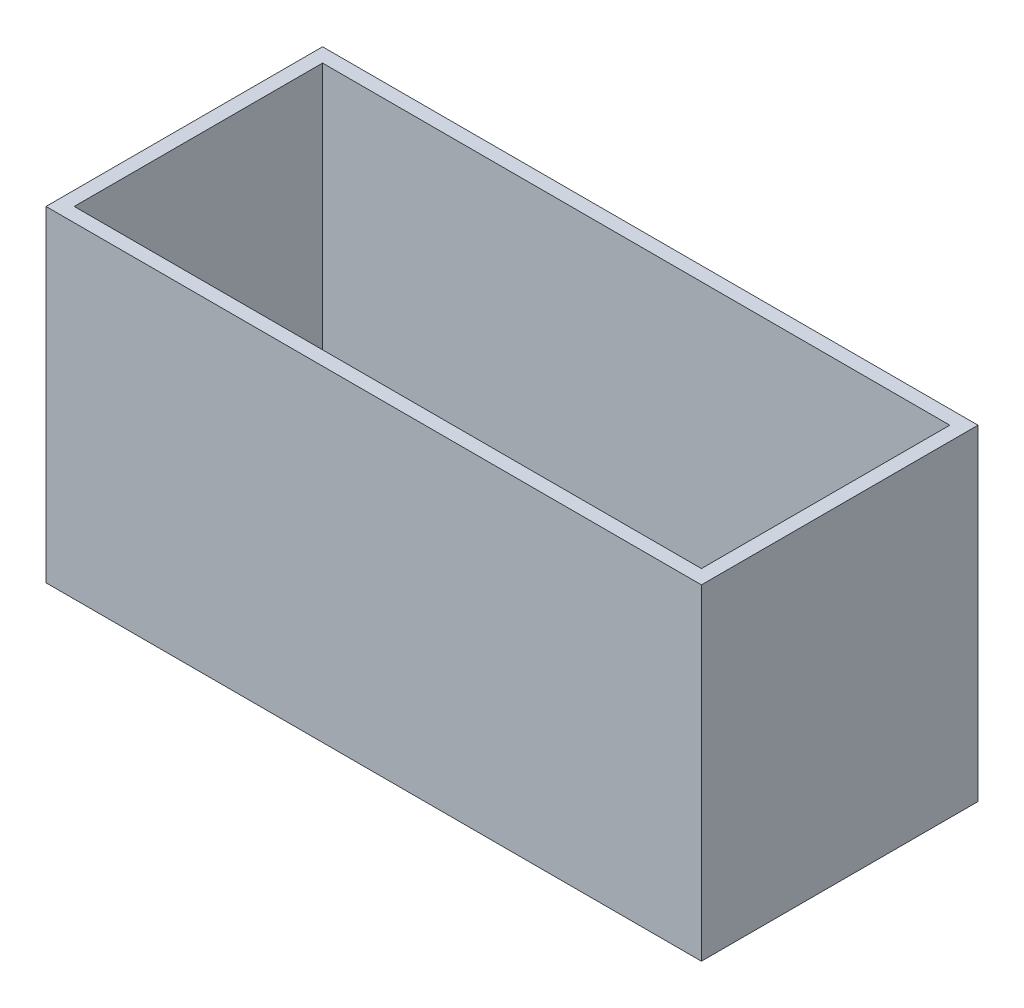
ISO-10303-21;
HEADER;
FILE_DESCRIPTION(('STEP AP214'),'2;1');
FILE_NAME('part.step','',(''),(''),'','','');
FILE_SCHEMA(('AUTOMOTIVE_DESIGN { 1 0 10303 214 1 1 1 1 }'));
ENDSEC;
DATA;
#1=APPLICATION_CONTEXT('core data for automotive mechanical design processes');
#2=APPLICATION_PROTOCOL_DEFINITION('international standard','automotive_design',2000,#1);
#3=PRODUCT_CONTEXT('',#1,'mechanical');
#4=PRODUCT('Part','Part','',(#3));
#5=PRODUCT_RELATED_PRODUCT_CATEGORY('part','',(#4));
#6=PRODUCT_DEFINITION_FORMATION('','',#4);
#7=PRODUCT_DEFINITION_CONTEXT('part definition',#1,'design');
#8=PRODUCT_DEFINITION('design','',#6,#7);
#9=PRODUCT_DEFINITION_SHAPE('','',#8);
#10=(LENGTH_UNIT() NAMED_UNIT(*) SI_UNIT(.MILLI.,.METRE.));
#11=(NAMED_UNIT(*) PLANE_ANGLE_UNIT() SI_UNIT($,.RADIAN.));
#12=(NAMED_UNIT(*) SI_UNIT($,.STERADIAN.) SOLID_ANGLE_UNIT());
#13=UNCERTAINTY_MEASURE_WITH_UNIT(LENGTH_MEASURE(1.E-05),#10,'distance_accuracy_value','');
#14=(GEOMETRIC_REPRESENTATION_CONTEXT(3) GLOBAL_UNCERTAINTY_ASSIGNED_CONTEXT((#13)) GLOBAL_UNIT_ASSIGNED_CONTEXT((#10,
#11,#12)) REPRESENTATION_CONTEXT('',''));
#15=CARTESIAN_POINT('',(0.,0.,0.));
#16=DIRECTION('',(0.,0.,1.));
#17=DIRECTION('',(1.,0.,0.));
#18=AXIS2_PLACEMENT_3D('',#15,#16,#17);
#19=CARTESIAN_POINT('',(0.,20.,0.));
#20=DIRECTION('',(0.,-1.,0.));
#21=DIRECTION('',(0.,0.,-1.));
#22=AXIS2_PLACEMENT_3D('',#19,#20,#21);
#23=PLANE('',#22);
#24=DIRECTION('',(0.,0.,-1.));
#25=VECTOR('',#24,1.);
#26=CARTESIAN_POINT('',(-444.5,20.,0.));
#27=LINE('',#26,#25);
#28=CARTESIAN_POINT('',(-444.5,20.,176.));
#29=VERTEX_POINT('',#28);
#30=CARTESIAN_POINT('',(-444.5,20.,-176.));
#31=VERTEX_POINT('',#30);
#32=EDGE_CURVE('E130',#29,#31,#27,.T.);
#33=ORIENTED_EDGE('',*,*,#32,.F.);
#34=DIRECTION('',(-1.,0.,0.));
#35=VECTOR('',#34,1.);
#36=CARTESIAN_POINT('',(0.,20.,176.));
#37=LINE('',#36,#35);
#38=CARTESIAN_POINT('',(444.5,20.,176.));
#39=VERTEX_POINT('',#38);
#40=EDGE_CURVE('E188',#39,#29,#37,.T.);
#41=ORIENTED_EDGE('',*,*,#40,.F.);
#42=DIRECTION('',(0.,0.,1.));
#43=VECTOR('',#42,1.);
#44=CARTESIAN_POINT('',(444.5,20.,0.));
#45=LINE('',#44,#43);
#46=CARTESIAN_POINT('',(444.5,20.,-176.));
#47=VERTEX_POINT('',#46);
#48=EDGE_CURVE('E194',#47,#39,#45,.T.);
#49=ORIENTED_EDGE('',*,*,#48,.F.);
#50=DIRECTION('',(1.,0.,0.));
#51=VECTOR('',#50,1.);
#52=CARTESIAN_POINT('',(0.,20.,-176.));
#53=LINE('',#52,#51);
#54=EDGE_CURVE('E140',#31,#47,#53,.T.);
#55=ORIENTED_EDGE('',*,*,#54,.F.);
#56=EDGE_LOOP('',(#33,#41,#49,#55));
#57=FACE_BOUND('',#56,.T.);
#58=ADVANCED_FACE('F45',(#57),#23,.F.);
#59=CARTESIAN_POINT('',(-464.5,462.,-176.));
#60=DIRECTION('',(0.,0.,-1.));
#61=DIRECTION('',(-1.,0.,0.));
#62=AXIS2_PLACEMENT_3D('',#59,#60,#61);
#63=PLANE('',#62);
#64=DIRECTION('',(0.,-1.,0.));
#65=VECTOR('',#64,1.);
#66=CARTESIAN_POINT('',(-444.5,462.,-176.));
#67=LINE('',#66,#65);
#68=CARTESIAN_POINT('',(-444.5,462.,-176.));
#69=VERTEX_POINT('',#68);
#70=EDGE_CURVE('E127',#69,#31,#67,.T.);
#71=ORIENTED_EDGE('',*,*,#70,.T.);
#72=ORIENTED_EDGE('',*,*,#54,.T.);
#73=DIRECTION('',(0.,-1.,0.));
#74=VECTOR('',#73,1.);
#75=CARTESIAN_POINT('',(444.5,462.,-176.));
#76=LINE('',#75,#74);
#77=CARTESIAN_POINT('',(444.5,462.,-176.));
#78=VERTEX_POINT('',#77);
#79=EDGE_CURVE('E138',#78,#47,#76,.T.);
#80=ORIENTED_EDGE('',*,*,#79,.F.);
#81=DIRECTION('',(1.,0.,0.));
#82=VECTOR('',#81,1.);
#83=CARTESIAN_POINT('',(-464.5,462.,-176.));
#84=LINE('',#83,#82);
#85=EDGE_CURVE('E118',#69,#78,#84,.T.);
#86=ORIENTED_EDGE('',*,*,#85,.F.);
#87=EDGE_LOOP('',(#71,#72,#80,#86));
#88=FACE_BOUND('',#87,.T.);
#89=ADVANCED_FACE('F136',(#88),#63,.F.);
#90=CARTESIAN_POINT('',(-464.5,462.,176.));
#91=DIRECTION('',(0.,0.,1.));
#92=DIRECTION('',(1.,0.,0.));
#93=AXIS2_PLACEMENT_3D('',#90,#91,#92);
#94=PLANE('',#93);
#95=DIRECTION('',(0.,-1.,0.));
#96=VECTOR('',#95,1.);
#97=CARTESIAN_POINT('',(-444.5,462.,176.));
#98=LINE('',#97,#96);
#99=CARTESIAN_POINT('',(-444.5,462.,176.));
#100=VERTEX_POINT('',#99);
#101=EDGE_CURVE('E124',#100,#29,#98,.T.);
#102=ORIENTED_EDGE('',*,*,#101,.F.);
#103=DIRECTION('',(-1.,0.,0.));
#104=VECTOR('',#103,1.);
#105=CARTESIAN_POINT('',(-464.5,462.,176.));
#106=LINE('',#105,#104);
#107=CARTESIAN_POINT('',(444.5,462.,176.));
#108=VERTEX_POINT('',#107);
#109=EDGE_CURVE('E120',#108,#100,#106,.T.);
#110=ORIENTED_EDGE('',*,*,#109,.F.);
#111=DIRECTION('',(0.,-1.,0.));
#112=VECTOR('',#111,1.);
#113=CARTESIAN_POINT('',(444.5,462.,176.));
#114=LINE('',#113,#112);
#115=EDGE_CURVE('E61',#108,#39,#114,.T.);
#116=ORIENTED_EDGE('',*,*,#115,.T.);
#117=ORIENTED_EDGE('',*,*,#40,.T.);
#118=EDGE_LOOP('',(#102,#110,#116,#117));
#119=FACE_BOUND('',#118,.T.);
#120=ADVANCED_FACE('F208',(#119),#94,.F.);
#121=CARTESIAN_POINT('',(464.5,20.,196.));
#122=DIRECTION('',(-1.,0.,0.));
#123=DIRECTION('',(0.,0.,1.));
#124=AXIS2_PLACEMENT_3D('',#121,#122,#123);
#125=PLANE('',#124);
#126=DIRECTION('',(0.,0.,-1.));
#127=VECTOR('',#126,1.);
#128=CARTESIAN_POINT('',(464.5,0.,196.));
#129=LINE('',#128,#127);
#130=CARTESIAN_POINT('',(464.5,0.,196.));
#131=VERTEX_POINT('',#130);
#132=CARTESIAN_POINT('',(464.5,0.,-196.));
#133=VERTEX_POINT('',#132);
#134=EDGE_CURVE('E145',#131,#133,#129,.T.);
#135=ORIENTED_EDGE('',*,*,#134,.T.);
#136=DIRECTION('',(0.,-1.,0.));
#137=VECTOR('',#136,1.);
#138=CARTESIAN_POINT('',(464.5,20.,-196.));
#139=LINE('',#138,#137);
#140=CARTESIAN_POINT('',(464.5,462.,-196.));
#141=VERTEX_POINT('',#140);
#142=EDGE_CURVE('E11',#141,#133,#139,.T.);
#143=ORIENTED_EDGE('',*,*,#142,.F.);
#144=DIRECTION('',(0.,0.,-1.));
#145=VECTOR('',#144,1.);
#146=CARTESIAN_POINT('',(464.5,462.,-176.));
#147=LINE('',#146,#145);
#148=CARTESIAN_POINT('',(464.5,462.,196.));
#149=VERTEX_POINT('',#148);
#150=EDGE_CURVE('E182',#149,#141,#147,.T.);
#151=ORIENTED_EDGE('',*,*,#150,.F.);
#152=DIRECTION('',(0.,-1.,0.));
#153=VECTOR('',#152,1.);
#154=CARTESIAN_POINT('',(464.5,20.,196.));
#155=LINE('',#154,#153);
#156=EDGE_CURVE('E161',#149,#131,#155,.T.);
#157=ORIENTED_EDGE('',*,*,#156,.T.);
#158=EDGE_LOOP('',(#135,#143,#151,#157));
#159=FACE_BOUND('',#158,.T.);
#160=ADVANCED_FACE('F47',(#159),#125,.F.);
#161=CARTESIAN_POINT('',(-464.5,20.,-196.));
#162=DIRECTION('',(0.,0.,1.));
#163=DIRECTION('',(1.,0.,0.));
#164=AXIS2_PLACEMENT_3D('',#161,#162,#163);
#165=PLANE('',#164);
#166=DIRECTION('',(-1.,0.,0.));
#167=VECTOR('',#166,1.);
#168=CARTESIAN_POINT('',(-464.5,0.,-196.));
#169=LINE('',#168,#167);
#170=CARTESIAN_POINT('',(-464.5,0.,-196.));
#171=VERTEX_POINT('',#170);
#172=EDGE_CURVE('E153',#133,#171,#169,.T.);
#173=ORIENTED_EDGE('',*,*,#172,.T.);
#174=DIRECTION('',(0.,-1.,0.));
#175=VECTOR('',#174,1.);
#176=CARTESIAN_POINT('',(-464.5,20.,-196.));
#177=LINE('',#176,#175);
#178=CARTESIAN_POINT('',(-464.5,462.,-196.));
#179=VERTEX_POINT('',#178);
#180=EDGE_CURVE('E54',#179,#171,#177,.T.);
#181=ORIENTED_EDGE('',*,*,#180,.F.);
#182=DIRECTION('',(-1.,0.,0.));
#183=VECTOR('',#182,1.);
#184=CARTESIAN_POINT('',(-464.5,462.,-196.));
#185=LINE('',#184,#183);
#186=EDGE_CURVE('E147',#141,#179,#185,.T.);
#187=ORIENTED_EDGE('',*,*,#186,.F.);
#188=ORIENTED_EDGE('',*,*,#142,.T.);
#189=EDGE_LOOP('',(#173,#181,#187,#188));
#190=FACE_BOUND('',#189,.T.);
#191=ADVANCED_FACE('F200',(#190),#165,.F.);
#192=CARTESIAN_POINT('',(-464.5,20.,196.));
#193=DIRECTION('',(1.,0.,0.));
#194=DIRECTION('',(0.,0.,-1.));
#195=AXIS2_PLACEMENT_3D('',#192,#193,#194);
#196=PLANE('',#195);
#197=DIRECTION('',(0.,-1.,0.));
#198=VECTOR('',#197,1.);
#199=CARTESIAN_POINT('',(-464.5,20.,196.));
#200=LINE('',#199,#198);
#201=CARTESIAN_POINT('',(-464.5,462.,196.));
#202=VERTEX_POINT('',#201);
#203=CARTESIAN_POINT('',(-464.5,0.,196.));
#204=VERTEX_POINT('',#203);
#205=EDGE_CURVE('E164',#202,#204,#200,.T.);
#206=ORIENTED_EDGE('',*,*,#205,.F.);
#207=DIRECTION('',(0.,0.,1.));
#208=VECTOR('',#207,1.);
#209=CARTESIAN_POINT('',(-464.5,462.,-176.));
#210=LINE('',#209,#208);
#211=EDGE_CURVE('E141',#179,#202,#210,.T.);
#212=ORIENTED_EDGE('',*,*,#211,.F.);
#213=ORIENTED_EDGE('',*,*,#180,.T.);
#214=DIRECTION('',(0.,0.,1.));
#215=VECTOR('',#214,1.);
#216=CARTESIAN_POINT('',(-464.5,0.,196.));
#217=LINE('',#216,#215);
#218=EDGE_CURVE('E156',#171,#204,#217,.T.);
#219=ORIENTED_EDGE('',*,*,#218,.T.);
#220=EDGE_LOOP('',(#206,#212,#213,#219));
#221=FACE_BOUND('',#220,.T.);
#222=ADVANCED_FACE('F172',(#221),#196,.F.);
#223=CARTESIAN_POINT('',(-464.5,20.,196.));
#224=DIRECTION('',(0.,0.,-1.));
#225=DIRECTION('',(-1.,0.,0.));
#226=AXIS2_PLACEMENT_3D('',#223,#224,#225);
#227=PLANE('',#226);
#228=DIRECTION('',(1.,0.,0.));
#229=VECTOR('',#228,1.);
#230=CARTESIAN_POINT('',(-464.5,0.,196.));
#231=LINE('',#230,#229);
#232=EDGE_CURVE('E69',#204,#131,#231,.T.);
#233=ORIENTED_EDGE('',*,*,#232,.T.);
#234=ORIENTED_EDGE('',*,*,#156,.F.);
#235=DIRECTION('',(1.,0.,0.));
#236=VECTOR('',#235,1.);
#237=CARTESIAN_POINT('',(-464.5,462.,196.));
#238=LINE('',#237,#236);
#239=EDGE_CURVE('E186',#202,#149,#238,.T.);
#240=ORIENTED_EDGE('',*,*,#239,.F.);
#241=ORIENTED_EDGE('',*,*,#205,.T.);
#242=EDGE_LOOP('',(#233,#234,#240,#241));
#243=FACE_BOUND('',#242,.T.);
#244=ADVANCED_FACE('F185',(#243),#227,.F.);
#245=CARTESIAN_POINT('',(0.,0.,0.));
#246=DIRECTION('',(0.,-1.,0.));
#247=DIRECTION('',(0.,0.,-1.));
#248=AXIS2_PLACEMENT_3D('',#245,#246,#247);
#249=PLANE('',#248);
#250=ORIENTED_EDGE('',*,*,#232,.F.);
#251=ORIENTED_EDGE('',*,*,#218,.F.);
#252=ORIENTED_EDGE('',*,*,#172,.F.);
#253=ORIENTED_EDGE('',*,*,#134,.F.);
#254=EDGE_LOOP('',(#250,#251,#252,#253));
#255=FACE_BOUND('',#254,.T.);
#256=ADVANCED_FACE('F178',(#255),#249,.T.);
#257=CARTESIAN_POINT('',(0.,462.,0.));
#258=DIRECTION('',(0.,-1.,0.));
#259=DIRECTION('',(0.,0.,-1.));
#260=AXIS2_PLACEMENT_3D('',#257,#258,#259);
#261=PLANE('',#260);
#262=DIRECTION('',(0.,0.,-1.));
#263=VECTOR('',#262,1.);
#264=CARTESIAN_POINT('',(-444.5,462.,176.));
#265=LINE('',#264,#263);
#266=EDGE_CURVE('E113',#100,#69,#265,.T.);
#267=ORIENTED_EDGE('',*,*,#266,.T.);
#268=ORIENTED_EDGE('',*,*,#85,.T.);
#269=DIRECTION('',(0.,0.,1.));
#270=VECTOR('',#269,1.);
#271=CARTESIAN_POINT('',(444.5,462.,176.));
#272=LINE('',#271,#270);
#273=EDGE_CURVE('E330',#78,#108,#272,.T.);
#274=ORIENTED_EDGE('',*,*,#273,.T.);
#275=ORIENTED_EDGE('',*,*,#109,.T.);
#276=EDGE_LOOP('',(#267,#268,#274,#275));
#277=FACE_BOUND('',#276,.T.);
#278=ORIENTED_EDGE('',*,*,#150,.T.);
#279=ORIENTED_EDGE('',*,*,#186,.T.);
#280=ORIENTED_EDGE('',*,*,#211,.T.);
#281=ORIENTED_EDGE('',*,*,#239,.T.);
#282=EDGE_LOOP('',(#278,#279,#280,#281));
#283=FACE_BOUND('',#282,.T.);
#284=ADVANCED_FACE('F115',(#277,#283),#261,.F.);
#285=CARTESIAN_POINT('',(444.5,462.,176.));
#286=DIRECTION('',(1.,0.,0.));
#287=DIRECTION('',(0.,0.,-1.));
#288=AXIS2_PLACEMENT_3D('',#285,#286,#287);
#289=PLANE('',#288);
#290=ORIENTED_EDGE('',*,*,#79,.T.);
#291=ORIENTED_EDGE('',*,*,#48,.T.);
#292=ORIENTED_EDGE('',*,*,#115,.F.);
#293=ORIENTED_EDGE('',*,*,#273,.F.);
#294=EDGE_LOOP('',(#290,#291,#292,#293));
#295=FACE_BOUND('',#294,.T.);
#296=ADVANCED_FACE('F234',(#295),#289,.F.);
#297=CARTESIAN_POINT('',(-444.5,462.,176.));
#298=DIRECTION('',(-1.,0.,0.));
#299=DIRECTION('',(0.,0.,1.));
#300=AXIS2_PLACEMENT_3D('',#297,#298,#299);
#301=PLANE('',#300);
#302=ORIENTED_EDGE('',*,*,#101,.T.);
#303=ORIENTED_EDGE('',*,*,#32,.T.);
#304=ORIENTED_EDGE('',*,*,#70,.F.);
#305=ORIENTED_EDGE('',*,*,#266,.F.);
#306=EDGE_LOOP('',(#302,#303,#304,#305));
#307=FACE_BOUND('',#306,.T.);
#308=ADVANCED_FACE('F128',(#307),#301,.F.);
#309=CLOSED_SHELL('',(#58,#89,#120,#160,#191,#222,#244,#256,#284,#296,#308));
#310=MANIFOLD_SOLID_BREP('B2',#309);
#311=ADVANCED_BREP_SHAPE_REPRESENTATION('',(#18,#310),#14);
#312=SHAPE_DEFINITION_REPRESENTATION(#9,#311);
ENDSEC;
END-ISO-10303-21;
